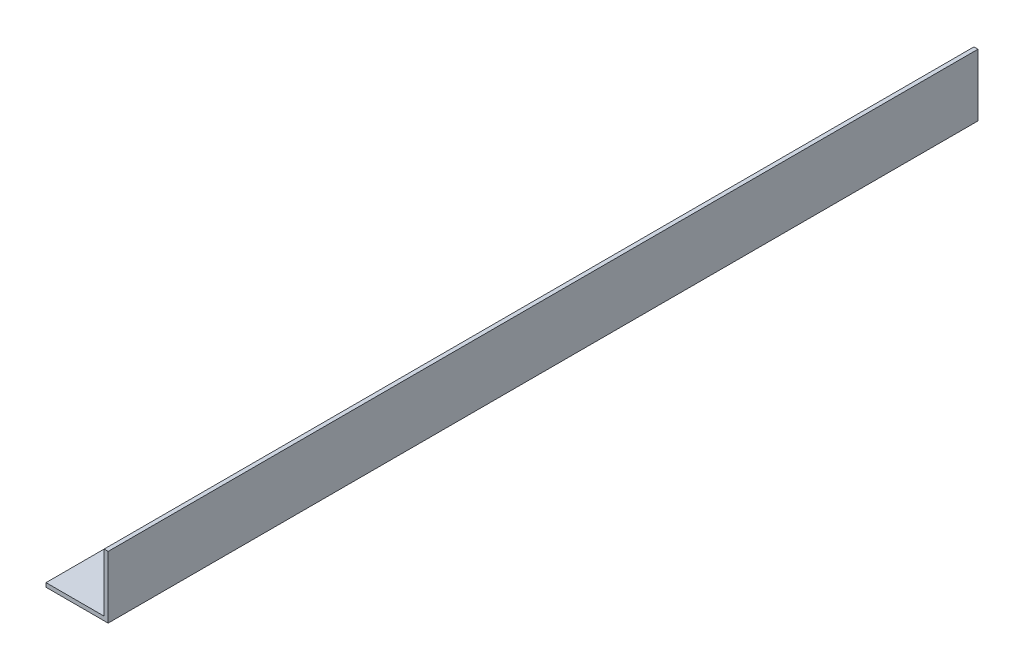
ISO-10303-21;
HEADER;
FILE_DESCRIPTION(('STEP AP214'),'2;1');
FILE_NAME('part.step','',(''),(''),'','','');
FILE_SCHEMA(('AUTOMOTIVE_DESIGN { 1 0 10303 214 1 1 1 1 }'));
ENDSEC;
DATA;
#1=APPLICATION_CONTEXT('core data for automotive mechanical design processes');
#2=APPLICATION_PROTOCOL_DEFINITION('international standard','automotive_design',2000,#1);
#3=PRODUCT_CONTEXT('',#1,'mechanical');
#4=PRODUCT('Part','Part','',(#3));
#5=PRODUCT_RELATED_PRODUCT_CATEGORY('part','',(#4));
#6=PRODUCT_DEFINITION_FORMATION('','',#4);
#7=PRODUCT_DEFINITION_CONTEXT('part definition',#1,'design');
#8=PRODUCT_DEFINITION('design','',#6,#7);
#9=PRODUCT_DEFINITION_SHAPE('','',#8);
#10=(LENGTH_UNIT() NAMED_UNIT(*) SI_UNIT(.MILLI.,.METRE.));
#11=(NAMED_UNIT(*) PLANE_ANGLE_UNIT() SI_UNIT($,.RADIAN.));
#12=(NAMED_UNIT(*) SI_UNIT($,.STERADIAN.) SOLID_ANGLE_UNIT());
#13=UNCERTAINTY_MEASURE_WITH_UNIT(LENGTH_MEASURE(1.E-05),#10,'distance_accuracy_value','');
#14=(GEOMETRIC_REPRESENTATION_CONTEXT(3) GLOBAL_UNCERTAINTY_ASSIGNED_CONTEXT((#13)) GLOBAL_UNIT_ASSIGNED_CONTEXT((#10,
#11,#12)) REPRESENTATION_CONTEXT('',''));
#15=CARTESIAN_POINT('',(0.,0.,0.));
#16=DIRECTION('',(0.,0.,1.));
#17=DIRECTION('',(1.,0.,0.));
#18=AXIS2_PLACEMENT_3D('',#15,#16,#17);
#19=CARTESIAN_POINT('',(-47.7895756819322,0.,355.6));
#20=DIRECTION('',(1.,0.,0.));
#21=DIRECTION('',(0.,0.,-1.));
#22=AXIS2_PLACEMENT_3D('',#19,#20,#21);
#23=PLANE('',#22);
#24=DIRECTION('',(0.,-1.,0.));
#25=VECTOR('',#24,1.);
#26=CARTESIAN_POINT('',(-47.7895756819322,0.,355.6));
#27=LINE('',#26,#25);
#28=CARTESIAN_POINT('',(-47.7895756819322,-23.749,355.6));
#29=VERTEX_POINT('',#28);
#30=CARTESIAN_POINT('',(-47.7895756819322,-25.4,355.6));
#31=VERTEX_POINT('',#30);
#32=EDGE_CURVE('E79',#29,#31,#27,.T.);
#33=ORIENTED_EDGE('',*,*,#32,.F.);
#34=DIRECTION('',(0.,0.,-1.));
#35=VECTOR('',#34,1.);
#36=CARTESIAN_POINT('',(-47.7895756819322,-23.749,355.6));
#37=LINE('',#36,#35);
#38=CARTESIAN_POINT('',(-47.7895756819322,-23.749,0.));
#39=VERTEX_POINT('',#38);
#40=EDGE_CURVE('E99',#29,#39,#37,.T.);
#41=ORIENTED_EDGE('',*,*,#40,.T.);
#42=DIRECTION('',(0.,-1.,0.));
#43=VECTOR('',#42,1.);
#44=CARTESIAN_POINT('',(-47.7895756819322,0.,0.));
#45=LINE('',#44,#43);
#46=CARTESIAN_POINT('',(-47.7895756819322,-25.4,0.));
#47=VERTEX_POINT('',#46);
#48=EDGE_CURVE('E118',#39,#47,#45,.T.);
#49=ORIENTED_EDGE('',*,*,#48,.T.);
#50=DIRECTION('',(0.,0.,-1.));
#51=VECTOR('',#50,1.);
#52=CARTESIAN_POINT('',(-47.7895756819322,-25.4,355.6));
#53=LINE('',#52,#51);
#54=EDGE_CURVE('E41',#31,#47,#53,.T.);
#55=ORIENTED_EDGE('',*,*,#54,.F.);
#56=EDGE_LOOP('',(#33,#41,#49,#55));
#57=FACE_BOUND('',#56,.T.);
#58=ADVANCED_FACE('F33',(#57),#23,.F.);
#59=CARTESIAN_POINT('',(-47.7895756819322,-25.4,355.6));
#60=DIRECTION('',(0.,1.,0.));
#61=DIRECTION('',(0.,0.,1.));
#62=AXIS2_PLACEMENT_3D('',#59,#60,#61);
#63=PLANE('',#62);
#64=CARTESIAN_POINT('',(-34.9453199197569,-25.4,19.05));
#65=DIRECTION('',(0.,-1.,0.));
#66=DIRECTION('',(0.,0.,-1.));
#67=AXIS2_PLACEMENT_3D('',#64,#65,#66);
#68=CIRCLE('',#67,3.55600000000001);
#69=CARTESIAN_POINT('',(-34.9453199197569,-25.4,15.4939999999999));
#70=VERTEX_POINT('',#69);
#71=EDGE_CURVE('E111',#70,#70,#68,.T.);
#72=ORIENTED_EDGE('',*,*,#71,.F.);
#73=EDGE_LOOP('',(#72));
#74=FACE_BOUND('',#73,.T.);
#75=DIRECTION('',(1.,0.,0.));
#76=VECTOR('',#75,1.);
#77=CARTESIAN_POINT('',(-47.7895756819322,-25.4,0.));
#78=LINE('',#77,#76);
#79=CARTESIAN_POINT('',(-22.3895756819322,-25.4,0.));
#80=VERTEX_POINT('',#79);
#81=EDGE_CURVE('E127',#47,#80,#78,.T.);
#82=ORIENTED_EDGE('',*,*,#81,.T.);
#83=DIRECTION('',(0.,0.,-1.));
#84=VECTOR('',#83,1.);
#85=CARTESIAN_POINT('',(-22.3895756819322,-25.4,355.6));
#86=LINE('',#85,#84);
#87=CARTESIAN_POINT('',(-22.3895756819322,-25.4,355.6));
#88=VERTEX_POINT('',#87);
#89=EDGE_CURVE('E133',#88,#80,#86,.T.);
#90=ORIENTED_EDGE('',*,*,#89,.F.);
#91=DIRECTION('',(1.,0.,0.));
#92=VECTOR('',#91,1.);
#93=CARTESIAN_POINT('',(-47.7895756819322,-25.4,355.6));
#94=LINE('',#93,#92);
#95=EDGE_CURVE('E120',#31,#88,#94,.T.);
#96=ORIENTED_EDGE('',*,*,#95,.F.);
#97=ORIENTED_EDGE('',*,*,#54,.T.);
#98=EDGE_LOOP('',(#82,#90,#96,#97));
#99=FACE_BOUND('',#98,.T.);
#100=ADVANCED_FACE('F138',(#74,#99),#63,.F.);
#101=CARTESIAN_POINT('',(-22.3895756819322,0.,355.6));
#102=DIRECTION('',(-1.,0.,0.));
#103=DIRECTION('',(0.,-1.,0.));
#104=AXIS2_PLACEMENT_3D('',#101,#102,#103);
#105=PLANE('',#104);
#106=DIRECTION('',(0.,1.,0.));
#107=VECTOR('',#106,1.);
#108=CARTESIAN_POINT('',(-22.3895756819322,0.,0.));
#109=LINE('',#108,#107);
#110=CARTESIAN_POINT('',(-22.3895756819322,0.,0.));
#111=VERTEX_POINT('',#110);
#112=EDGE_CURVE('E74',#80,#111,#109,.T.);
#113=ORIENTED_EDGE('',*,*,#112,.T.);
#114=DIRECTION('',(0.,0.,-1.));
#115=VECTOR('',#114,1.);
#116=CARTESIAN_POINT('',(-22.3895756819322,0.,355.6));
#117=LINE('',#116,#115);
#118=CARTESIAN_POINT('',(-22.3895756819322,0.,355.6));
#119=VERTEX_POINT('',#118);
#120=EDGE_CURVE('E125',#119,#111,#117,.T.);
#121=ORIENTED_EDGE('',*,*,#120,.F.);
#122=DIRECTION('',(0.,1.,0.));
#123=VECTOR('',#122,1.);
#124=CARTESIAN_POINT('',(-22.3895756819322,0.,355.6));
#125=LINE('',#124,#123);
#126=EDGE_CURVE('E57',#88,#119,#125,.T.);
#127=ORIENTED_EDGE('',*,*,#126,.F.);
#128=ORIENTED_EDGE('',*,*,#89,.T.);
#129=EDGE_LOOP('',(#113,#121,#127,#128));
#130=FACE_BOUND('',#129,.T.);
#131=ADVANCED_FACE('F148',(#130),#105,.F.);
#132=CARTESIAN_POINT('',(-47.7895756819322,0.,355.6));
#133=DIRECTION('',(0.,-1.,0.));
#134=DIRECTION('',(1.,0.,0.));
#135=AXIS2_PLACEMENT_3D('',#132,#133,#134);
#136=PLANE('',#135);
#137=DIRECTION('',(-1.,0.,0.));
#138=VECTOR('',#137,1.);
#139=CARTESIAN_POINT('',(-47.7895756819322,0.,0.));
#140=LINE('',#139,#138);
#141=CARTESIAN_POINT('',(-24.0405756819322,0.,0.));
#142=VERTEX_POINT('',#141);
#143=EDGE_CURVE('E121',#111,#142,#140,.T.);
#144=ORIENTED_EDGE('',*,*,#143,.T.);
#145=DIRECTION('',(0.,0.,1.));
#146=VECTOR('',#145,1.);
#147=CARTESIAN_POINT('',(-24.0405756819322,0.,355.6));
#148=LINE('',#147,#146);
#149=CARTESIAN_POINT('',(-24.0405756819322,0.,355.6));
#150=VERTEX_POINT('',#149);
#151=EDGE_CURVE('E116',#142,#150,#148,.T.);
#152=ORIENTED_EDGE('',*,*,#151,.T.);
#153=DIRECTION('',(-1.,0.,0.));
#154=VECTOR('',#153,1.);
#155=CARTESIAN_POINT('',(-47.7895756819322,0.,355.6));
#156=LINE('',#155,#154);
#157=EDGE_CURVE('E108',#119,#150,#156,.T.);
#158=ORIENTED_EDGE('',*,*,#157,.F.);
#159=ORIENTED_EDGE('',*,*,#120,.T.);
#160=EDGE_LOOP('',(#144,#152,#158,#159));
#161=FACE_BOUND('',#160,.T.);
#162=ADVANCED_FACE('F147',(#161),#136,.F.);
#163=CARTESIAN_POINT('',(0.,0.,355.6));
#164=DIRECTION('',(0.,0.,1.));
#165=DIRECTION('',(1.,0.,0.));
#166=AXIS2_PLACEMENT_3D('',#163,#164,#165);
#167=PLANE('',#166);
#168=DIRECTION('',(0.,1.,0.));
#169=VECTOR('',#168,1.);
#170=CARTESIAN_POINT('',(-24.0405756819322,2.729044322172,355.6));
#171=LINE('',#170,#169);
#172=CARTESIAN_POINT('',(-24.0405756819322,-23.749,355.6));
#173=VERTEX_POINT('',#172);
#174=EDGE_CURVE('E101',#173,#150,#171,.T.);
#175=ORIENTED_EDGE('',*,*,#174,.F.);
#176=DIRECTION('',(1.,0.,0.));
#177=VECTOR('',#176,1.);
#178=CARTESIAN_POINT('',(-50.2143853273278,-23.749,355.6));
#179=LINE('',#178,#177);
#180=EDGE_CURVE('E95',#29,#173,#179,.T.);
#181=ORIENTED_EDGE('',*,*,#180,.F.);
#182=ORIENTED_EDGE('',*,*,#32,.T.);
#183=ORIENTED_EDGE('',*,*,#95,.T.);
#184=ORIENTED_EDGE('',*,*,#126,.T.);
#185=ORIENTED_EDGE('',*,*,#157,.T.);
#186=EDGE_LOOP('',(#175,#181,#182,#183,#184,#185));
#187=FACE_BOUND('',#186,.T.);
#188=ADVANCED_FACE('F106',(#187),#167,.T.);
#189=CARTESIAN_POINT('',(0.,0.,0.));
#190=DIRECTION('',(0.,0.,1.));
#191=DIRECTION('',(1.,0.,0.));
#192=AXIS2_PLACEMENT_3D('',#189,#190,#191);
#193=PLANE('',#192);
#194=DIRECTION('',(1.,0.,0.));
#195=VECTOR('',#194,1.);
#196=CARTESIAN_POINT('',(0.,-23.749,0.));
#197=LINE('',#196,#195);
#198=CARTESIAN_POINT('',(-24.0405756819322,-23.749,0.));
#199=VERTEX_POINT('',#198);
#200=EDGE_CURVE('E11',#39,#199,#197,.T.);
#201=ORIENTED_EDGE('',*,*,#200,.T.);
#202=DIRECTION('',(0.,1.,0.));
#203=VECTOR('',#202,1.);
#204=CARTESIAN_POINT('',(-24.0405756819322,2.729044322172,0.));
#205=LINE('',#204,#203);
#206=EDGE_CURVE('E48',#199,#142,#205,.T.);
#207=ORIENTED_EDGE('',*,*,#206,.T.);
#208=ORIENTED_EDGE('',*,*,#143,.F.);
#209=ORIENTED_EDGE('',*,*,#112,.F.);
#210=ORIENTED_EDGE('',*,*,#81,.F.);
#211=ORIENTED_EDGE('',*,*,#48,.F.);
#212=EDGE_LOOP('',(#201,#207,#208,#209,#210,#211));
#213=FACE_BOUND('',#212,.T.);
#214=ADVANCED_FACE('F144',(#213),#193,.F.);
#215=CARTESIAN_POINT('',(-24.0405756819322,2.729044322172,0.));
#216=DIRECTION('',(1.,0.,0.));
#217=DIRECTION('',(0.,1.,0.));
#218=AXIS2_PLACEMENT_3D('',#215,#216,#217);
#219=PLANE('',#218);
#220=ORIENTED_EDGE('',*,*,#206,.F.);
#221=DIRECTION('',(0.,0.,1.));
#222=VECTOR('',#221,1.);
#223=CARTESIAN_POINT('',(-24.0405756819322,-23.749,0.));
#224=LINE('',#223,#222);
#225=EDGE_CURVE('E97',#199,#173,#224,.T.);
#226=ORIENTED_EDGE('',*,*,#225,.T.);
#227=ORIENTED_EDGE('',*,*,#174,.T.);
#228=ORIENTED_EDGE('',*,*,#151,.F.);
#229=EDGE_LOOP('',(#220,#226,#227,#228));
#230=FACE_BOUND('',#229,.T.);
#231=ADVANCED_FACE('F103',(#230),#219,.F.);
#232=CARTESIAN_POINT('',(-50.2143853273278,-23.749,0.));
#233=DIRECTION('',(0.,-1.,0.));
#234=DIRECTION('',(0.,0.,-1.));
#235=AXIS2_PLACEMENT_3D('',#232,#233,#234);
#236=PLANE('',#235);
#237=CARTESIAN_POINT('',(-34.9453199197569,-23.749,19.05));
#238=DIRECTION('',(0.,-1.,0.));
#239=DIRECTION('',(0.,0.,-1.));
#240=AXIS2_PLACEMENT_3D('',#237,#238,#239);
#241=CIRCLE('',#240,3.55600000000001);
#242=CARTESIAN_POINT('',(-34.9453199197569,-23.749,15.4939999999999));
#243=VERTEX_POINT('',#242);
#244=EDGE_CURVE('E36',#243,#243,#241,.T.);
#245=ORIENTED_EDGE('',*,*,#244,.T.);
#246=EDGE_LOOP('',(#245));
#247=FACE_BOUND('',#246,.T.);
#248=ORIENTED_EDGE('',*,*,#180,.T.);
#249=ORIENTED_EDGE('',*,*,#225,.F.);
#250=ORIENTED_EDGE('',*,*,#200,.F.);
#251=ORIENTED_EDGE('',*,*,#40,.F.);
#252=EDGE_LOOP('',(#248,#249,#250,#251));
#253=FACE_BOUND('',#252,.T.);
#254=ADVANCED_FACE('F96',(#247,#253),#236,.F.);
#255=CARTESIAN_POINT('',(-34.9453199197569,0.,19.05));
#256=DIRECTION('',(0.,-1.,0.));
#257=DIRECTION('',(0.,0.,-1.));
#258=AXIS2_PLACEMENT_3D('',#255,#256,#257);
#259=CYLINDRICAL_SURFACE('',#258,3.55600000000001);
#260=CARTESIAN_POINT('',(-34.9453199197569,-25.4,15.4939999999999));
#261=CARTESIAN_POINT('',(-34.9453199197569,-25.3828020833333,15.4939999999999));
#262=CARTESIAN_POINT('',(-34.9453199197569,-25.3656041666667,15.4939999999999));
#263=CARTESIAN_POINT('',(-34.9453199197569,-25.3312083333333,15.4939999999999));
#264=CARTESIAN_POINT('',(-34.9453199197569,-25.3140104166667,15.4939999999999));
#265=CARTESIAN_POINT('',(-34.9453199197569,-25.2796145833333,15.4939999999999));
#266=CARTESIAN_POINT('',(-34.9453199197569,-25.2624166666667,15.4939999999999));
#267=CARTESIAN_POINT('',(-34.9453199197569,-25.2280208333333,15.4939999999999));
#268=CARTESIAN_POINT('',(-34.9453199197569,-25.2108229166667,15.4939999999999));
#269=CARTESIAN_POINT('',(-34.9453199197569,-25.1764270833333,15.4939999999999));
#270=CARTESIAN_POINT('',(-34.9453199197569,-25.1592291666667,15.4939999999999));
#271=CARTESIAN_POINT('',(-34.9453199197569,-25.1248333333333,15.4939999999999));
#272=CARTESIAN_POINT('',(-34.9453199197569,-25.1076354166667,15.4939999999999));
#273=CARTESIAN_POINT('',(-34.9453199197569,-25.0732395833333,15.4939999999999));
#274=CARTESIAN_POINT('',(-34.9453199197569,-25.0560416666667,15.4939999999999));
#275=CARTESIAN_POINT('',(-34.9453199197569,-25.0216458333333,15.4939999999999));
#276=CARTESIAN_POINT('',(-34.9453199197569,-25.0044479166667,15.4939999999999));
#277=CARTESIAN_POINT('',(-34.9453199197569,-24.9700520833333,15.4939999999999));
#278=CARTESIAN_POINT('',(-34.9453199197569,-24.9528541666667,15.4939999999999));
#279=CARTESIAN_POINT('',(-34.9453199197569,-24.9184583333333,15.4939999999999));
#280=CARTESIAN_POINT('',(-34.9453199197569,-24.9012604166667,15.4939999999999));
#281=CARTESIAN_POINT('',(-34.9453199197569,-24.8668645833333,15.4939999999999));
#282=CARTESIAN_POINT('',(-34.9453199197569,-24.8496666666667,15.4939999999999));
#283=CARTESIAN_POINT('',(-34.9453199197569,-24.8152708333333,15.4939999999999));
#284=CARTESIAN_POINT('',(-34.9453199197569,-24.7980729166667,15.4939999999999));
#285=CARTESIAN_POINT('',(-34.9453199197569,-24.7636770833333,15.4939999999999));
#286=CARTESIAN_POINT('',(-34.9453199197569,-24.7464791666667,15.4939999999999));
#287=CARTESIAN_POINT('',(-34.9453199197569,-24.7120833333333,15.4939999999999));
#288=CARTESIAN_POINT('',(-34.9453199197569,-24.6948854166667,15.4939999999999));
#289=CARTESIAN_POINT('',(-34.9453199197569,-24.6604895833333,15.4939999999999));
#290=CARTESIAN_POINT('',(-34.9453199197569,-24.6432916666667,15.4939999999999));
#291=CARTESIAN_POINT('',(-34.9453199197569,-24.6088958333333,15.4939999999999));
#292=CARTESIAN_POINT('',(-34.9453199197569,-24.5916979166667,15.4939999999999));
#293=CARTESIAN_POINT('',(-34.9453199197569,-24.5573020833333,15.4939999999999));
#294=CARTESIAN_POINT('',(-34.9453199197569,-24.5401041666667,15.4939999999999));
#295=CARTESIAN_POINT('',(-34.9453199197569,-24.5057083333333,15.4939999999999));
#296=CARTESIAN_POINT('',(-34.9453199197569,-24.4885104166667,15.4939999999999));
#297=CARTESIAN_POINT('',(-34.9453199197569,-24.4541145833333,15.4939999999999));
#298=CARTESIAN_POINT('',(-34.9453199197569,-24.4369166666667,15.4939999999999));
#299=CARTESIAN_POINT('',(-34.9453199197569,-24.4025208333333,15.4939999999999));
#300=CARTESIAN_POINT('',(-34.9453199197569,-24.3853229166667,15.4939999999999));
#301=CARTESIAN_POINT('',(-34.9453199197569,-24.3509270833333,15.4939999999999));
#302=CARTESIAN_POINT('',(-34.9453199197569,-24.3337291666667,15.4939999999999));
#303=CARTESIAN_POINT('',(-34.9453199197569,-24.2993333333333,15.4939999999999));
#304=CARTESIAN_POINT('',(-34.9453199197569,-24.2821354166667,15.4939999999999));
#305=CARTESIAN_POINT('',(-34.9453199197569,-24.2477395833333,15.4939999999999));
#306=CARTESIAN_POINT('',(-34.9453199197569,-24.2305416666667,15.4939999999999));
#307=CARTESIAN_POINT('',(-34.9453199197569,-24.1961458333333,15.4939999999999));
#308=CARTESIAN_POINT('',(-34.9453199197569,-24.1789479166667,15.4939999999999));
#309=CARTESIAN_POINT('',(-34.9453199197569,-24.1445520833333,15.4939999999999));
#310=CARTESIAN_POINT('',(-34.9453199197569,-24.1273541666667,15.4939999999999));
#311=CARTESIAN_POINT('',(-34.9453199197569,-24.0929583333333,15.4939999999999));
#312=CARTESIAN_POINT('',(-34.9453199197569,-24.0757604166667,15.4939999999999));
#313=CARTESIAN_POINT('',(-34.9453199197569,-24.0413645833333,15.4939999999999));
#314=CARTESIAN_POINT('',(-34.9453199197569,-24.0241666666667,15.4939999999999));
#315=CARTESIAN_POINT('',(-34.9453199197569,-23.9897708333333,15.4939999999999));
#316=CARTESIAN_POINT('',(-34.9453199197569,-23.9725729166667,15.4939999999999));
#317=CARTESIAN_POINT('',(-34.9453199197569,-23.9381770833333,15.4939999999999));
#318=CARTESIAN_POINT('',(-34.9453199197569,-23.9209791666667,15.4939999999999));
#319=CARTESIAN_POINT('',(-34.9453199197569,-23.8865833333333,15.4939999999999));
#320=CARTESIAN_POINT('',(-34.9453199197569,-23.8693854166667,15.4939999999999));
#321=CARTESIAN_POINT('',(-34.9453199197569,-23.8349895833333,15.4939999999999));
#322=CARTESIAN_POINT('',(-34.9453199197569,-23.8177916666667,15.4939999999999));
#323=CARTESIAN_POINT('',(-34.9453199197569,-23.7833958333333,15.4939999999999));
#324=CARTESIAN_POINT('',(-34.9453199197569,-23.7661979166667,15.4939999999999));
#325=CARTESIAN_POINT('',(-34.9453199197569,-23.749,15.4939999999999));
#326=B_SPLINE_CURVE_WITH_KNOTS('',3,(#260,#261,#262,#263,#264,#265,#266,#267,#268,#269,#270,
#271,#272,#273,#274,#275,#276,#277,#278,#279,#280,#281,#282,#283,#284,#285,#286,#287,#288,#289,
#290,#291,#292,#293,#294,#295,#296,#297,#298,#299,#300,#301,#302,#303,#304,#305,#306,#307,#308,
#309,#310,#311,#312,#313,#314,#315,#316,#317,#318,#319,#320,#321,#322,#323,#324,#325),
.UNSPECIFIED.,.F.,.F.,(4,2,2,2,2,2,2,2,2,2,2,2,2,2,2,2,2,2,2,2,2,2,2,2,2,2,2,2,2,2,2,2,4),(0.,
0.0515937499999987,0.103187500000001,0.15478125,0.206375000000002,0.25796875,0.309562499999999,
0.361156250000001,0.41275,0.464343749999999,0.515937500000001,0.567531249999999,
0.619124999999998,0.67071875,0.722312499999999,0.773906250000001,0.8255,0.877093749999999,
0.928687500000001,0.980281249999999,1.031875,1.08346875,1.1350625,1.18665625,1.23825,1.28984375,
1.3414375,1.39303125,1.444625,1.49621875,1.5478125,1.59940625,1.651),.UNSPECIFIED.);
#327=EDGE_CURVE('BSEAM180',#70,#243,#326,.T.);
#328=ORIENTED_EDGE('',*,*,#71,.T.);
#329=ORIENTED_EDGE('',*,*,#244,.F.);
#330=ORIENTED_EDGE('',*,*,#327,.T.);
#331=ORIENTED_EDGE('',*,*,#327,.F.);
#332=EDGE_LOOP('',(#328,#330,#329,#331));
#333=FACE_BOUND('',#332,.T.);
#334=ADVANCED_FACE('F180',(#333),#259,.F.);
#335=CLOSED_SHELL('',(#58,#100,#131,#162,#188,#214,#231,#254,#334));
#336=MANIFOLD_SOLID_BREP('B2',#335);
#337=ADVANCED_BREP_SHAPE_REPRESENTATION('',(#18,#336),#14);
#338=SHAPE_DEFINITION_REPRESENTATION(#9,#337);
ENDSEC;
END-ISO-10303-21;
